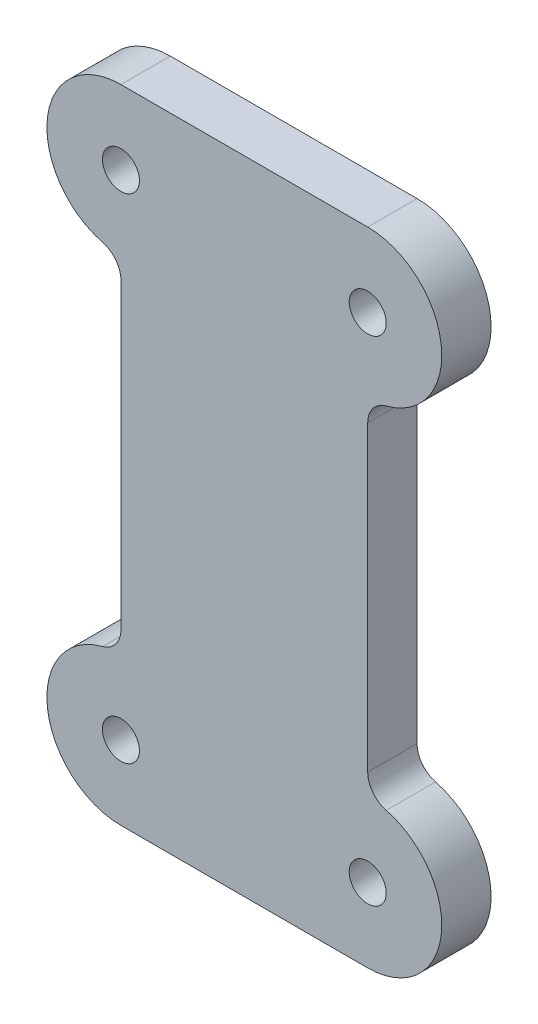
ISO-10303-21;
HEADER;
FILE_DESCRIPTION(('STEP AP214'),'2;1');
FILE_NAME('part.step','',(''),(''),'','','');
FILE_SCHEMA(('AUTOMOTIVE_DESIGN { 1 0 10303 214 1 1 1 1 }'));
ENDSEC;
DATA;
#1=APPLICATION_CONTEXT('core data for automotive mechanical design processes');
#2=APPLICATION_PROTOCOL_DEFINITION('international standard','automotive_design',2000,#1);
#3=PRODUCT_CONTEXT('',#1,'mechanical');
#4=PRODUCT('Part','Part','',(#3));
#5=PRODUCT_RELATED_PRODUCT_CATEGORY('part','',(#4));
#6=PRODUCT_DEFINITION_FORMATION('','',#4);
#7=PRODUCT_DEFINITION_CONTEXT('part definition',#1,'design');
#8=PRODUCT_DEFINITION('design','',#6,#7);
#9=PRODUCT_DEFINITION_SHAPE('','',#8);
#10=(LENGTH_UNIT() NAMED_UNIT(*) SI_UNIT(.MILLI.,.METRE.));
#11=(NAMED_UNIT(*) PLANE_ANGLE_UNIT() SI_UNIT($,.RADIAN.));
#12=(NAMED_UNIT(*) SI_UNIT($,.STERADIAN.) SOLID_ANGLE_UNIT());
#13=UNCERTAINTY_MEASURE_WITH_UNIT(LENGTH_MEASURE(1.E-05),#10,'distance_accuracy_value','');
#14=(GEOMETRIC_REPRESENTATION_CONTEXT(3) GLOBAL_UNCERTAINTY_ASSIGNED_CONTEXT((#13)) GLOBAL_UNIT_ASSIGNED_CONTEXT((#10,
#11,#12)) REPRESENTATION_CONTEXT('',''));
#15=CARTESIAN_POINT('',(0.,0.,0.));
#16=DIRECTION('',(0.,0.,1.));
#17=DIRECTION('',(1.,0.,0.));
#18=AXIS2_PLACEMENT_3D('',#15,#16,#17);
#19=CARTESIAN_POINT('',(0.,-41.275,-3.175));
#20=DIRECTION('',(0.,-1.,0.));
#21=DIRECTION('',(0.,0.,1.));
#22=AXIS2_PLACEMENT_3D('',#19,#20,#21);
#23=PLANE('',#22);
#24=DIRECTION('',(-1.,0.,0.));
#25=VECTOR('',#24,1.);
#26=CARTESIAN_POINT('',(0.,-41.275,0.));
#27=LINE('',#26,#25);
#28=CARTESIAN_POINT('',(15.875,-41.275,0.));
#29=VERTEX_POINT('',#28);
#30=CARTESIAN_POINT('',(-15.875,-41.275,0.));
#31=VERTEX_POINT('',#30);
#32=EDGE_CURVE('E314',#29,#31,#27,.T.);
#33=ORIENTED_EDGE('',*,*,#32,.T.);
#34=DIRECTION('',(0.,0.,1.));
#35=VECTOR('',#34,1.);
#36=CARTESIAN_POINT('',(-15.875,-41.275,-3.175));
#37=LINE('',#36,#35);
#38=CARTESIAN_POINT('',(-15.875,-41.275,-6.35));
#39=VERTEX_POINT('',#38);
#40=EDGE_CURVE('E223',#39,#31,#37,.T.);
#41=ORIENTED_EDGE('',*,*,#40,.F.);
#42=DIRECTION('',(1.,0.,0.));
#43=VECTOR('',#42,1.);
#44=CARTESIAN_POINT('',(0.,-41.275,-6.35));
#45=LINE('',#44,#43);
#46=CARTESIAN_POINT('',(15.875,-41.275,-6.35));
#47=VERTEX_POINT('',#46);
#48=EDGE_CURVE('E203',#39,#47,#45,.T.);
#49=ORIENTED_EDGE('',*,*,#48,.T.);
#50=DIRECTION('',(0.,0.,1.));
#51=VECTOR('',#50,1.);
#52=CARTESIAN_POINT('',(15.875,-41.275,-3.175));
#53=LINE('',#52,#51);
#54=EDGE_CURVE('E212',#47,#29,#53,.T.);
#55=ORIENTED_EDGE('',*,*,#54,.T.);
#56=EDGE_LOOP('',(#33,#41,#49,#55));
#57=FACE_BOUND('',#56,.T.);
#58=ADVANCED_FACE('F35',(#57),#23,.T.);
#59=CARTESIAN_POINT('',(15.875,-31.75,-3.175));
#60=DIRECTION('',(0.,0.,1.));
#61=DIRECTION('',(-1.,0.,0.));
#62=AXIS2_PLACEMENT_3D('',#59,#60,#61);
#63=CYLINDRICAL_SURFACE('',#62,9.525);
#64=CARTESIAN_POINT('',(15.875,-31.75,0.));
#65=DIRECTION('',(0.,0.,1.));
#66=DIRECTION('',(1.,0.,0.));
#67=AXIS2_PLACEMENT_3D('',#64,#65,#66);
#68=CIRCLE('',#67,9.525);
#69=CARTESIAN_POINT('',(18.25625,-22.5274584068436,0.));
#70=VERTEX_POINT('',#69);
#71=EDGE_CURVE('E215',#29,#70,#68,.T.);
#72=ORIENTED_EDGE('',*,*,#71,.F.);
#73=ORIENTED_EDGE('',*,*,#54,.F.);
#74=CARTESIAN_POINT('',(15.875,-31.75,-6.35));
#75=DIRECTION('',(0.,0.,1.));
#76=DIRECTION('',(1.,0.,0.));
#77=AXIS2_PLACEMENT_3D('',#74,#75,#76);
#78=CIRCLE('',#77,9.525);
#79=CARTESIAN_POINT('',(18.25625,-22.5274584068436,-6.35));
#80=VERTEX_POINT('',#79);
#81=EDGE_CURVE('E198',#47,#80,#78,.T.);
#82=ORIENTED_EDGE('',*,*,#81,.T.);
#83=DIRECTION('',(0.,0.,1.));
#84=VECTOR('',#83,1.);
#85=CARTESIAN_POINT('',(18.25625,-22.5274584068436,-3.175));
#86=LINE('',#85,#84);
#87=EDGE_CURVE('E220',#80,#70,#86,.T.);
#88=ORIENTED_EDGE('',*,*,#87,.T.);
#89=EDGE_LOOP('',(#72,#73,#82,#88));
#90=FACE_BOUND('',#89,.T.);
#91=ADVANCED_FACE('F213',(#90),#63,.T.);
#92=CARTESIAN_POINT('',(19.05,-19.4532778757914,-3.175));
#93=DIRECTION('',(0.,0.,1.));
#94=DIRECTION('',(-1.,0.,0.));
#95=AXIS2_PLACEMENT_3D('',#92,#93,#94);
#96=CYLINDRICAL_SURFACE('',#95,3.175);
#97=CARTESIAN_POINT('',(19.05,-19.4532778757914,0.));
#98=DIRECTION('',(0.,0.,1.));
#99=DIRECTION('',(1.,0.,0.));
#100=AXIS2_PLACEMENT_3D('',#97,#98,#99);
#101=CIRCLE('',#100,3.175);
#102=CARTESIAN_POINT('',(15.875,-19.4532778757914,0.));
#103=VERTEX_POINT('',#102);
#104=EDGE_CURVE('E317',#70,#103,#101,.F.);
#105=ORIENTED_EDGE('',*,*,#104,.F.);
#106=ORIENTED_EDGE('',*,*,#87,.F.);
#107=CARTESIAN_POINT('',(19.05,-19.4532778757914,-6.35));
#108=DIRECTION('',(0.,0.,1.));
#109=DIRECTION('',(1.,0.,0.));
#110=AXIS2_PLACEMENT_3D('',#107,#108,#109);
#111=CIRCLE('',#110,3.175);
#112=CARTESIAN_POINT('',(15.875,-19.4532778757914,-6.35));
#113=VERTEX_POINT('',#112);
#114=EDGE_CURVE('E206',#80,#113,#111,.F.);
#115=ORIENTED_EDGE('',*,*,#114,.T.);
#116=DIRECTION('',(0.,0.,1.));
#117=VECTOR('',#116,1.);
#118=CARTESIAN_POINT('',(15.875,-19.4532778757914,-3.175));
#119=LINE('',#118,#117);
#120=EDGE_CURVE('E377',#113,#103,#119,.T.);
#121=ORIENTED_EDGE('',*,*,#120,.T.);
#122=EDGE_LOOP('',(#105,#106,#115,#121));
#123=FACE_BOUND('',#122,.T.);
#124=ADVANCED_FACE('F500',(#123),#96,.F.);
#125=CARTESIAN_POINT('',(15.875,0.,-3.175));
#126=DIRECTION('',(-1.,0.,0.));
#127=DIRECTION('',(0.,0.,-1.));
#128=AXIS2_PLACEMENT_3D('',#125,#126,#127);
#129=PLANE('',#128);
#130=DIRECTION('',(0.,1.,0.));
#131=VECTOR('',#130,1.);
#132=CARTESIAN_POINT('',(15.875,0.,0.));
#133=LINE('',#132,#131);
#134=CARTESIAN_POINT('',(15.875,19.4532778757914,0.));
#135=VERTEX_POINT('',#134);
#136=EDGE_CURVE('E320',#103,#135,#133,.T.);
#137=ORIENTED_EDGE('',*,*,#136,.F.);
#138=ORIENTED_EDGE('',*,*,#120,.F.);
#139=DIRECTION('',(0.,1.,0.));
#140=VECTOR('',#139,1.);
#141=CARTESIAN_POINT('',(15.875,0.,-6.35));
#142=LINE('',#141,#140);
#143=CARTESIAN_POINT('',(15.875,19.4532778757914,-6.35));
#144=VERTEX_POINT('',#143);
#145=EDGE_CURVE('E228',#113,#144,#142,.T.);
#146=ORIENTED_EDGE('',*,*,#145,.T.);
#147=DIRECTION('',(0.,0.,1.));
#148=VECTOR('',#147,1.);
#149=CARTESIAN_POINT('',(15.875,19.4532778757914,-3.175));
#150=LINE('',#149,#148);
#151=EDGE_CURVE('E374',#144,#135,#150,.T.);
#152=ORIENTED_EDGE('',*,*,#151,.T.);
#153=EDGE_LOOP('',(#137,#138,#146,#152));
#154=FACE_BOUND('',#153,.T.);
#155=ADVANCED_FACE('F582',(#154),#129,.F.);
#156=CARTESIAN_POINT('',(19.05,19.4532778757914,-3.175));
#157=DIRECTION('',(0.,0.,1.));
#158=DIRECTION('',(-1.,0.,0.));
#159=AXIS2_PLACEMENT_3D('',#156,#157,#158);
#160=CYLINDRICAL_SURFACE('',#159,3.175);
#161=CARTESIAN_POINT('',(19.05,19.4532778757914,0.));
#162=DIRECTION('',(0.,0.,1.));
#163=DIRECTION('',(1.,0.,0.));
#164=AXIS2_PLACEMENT_3D('',#161,#162,#163);
#165=CIRCLE('',#164,3.175);
#166=CARTESIAN_POINT('',(18.25625,22.5274584068436,0.));
#167=VERTEX_POINT('',#166);
#168=EDGE_CURVE('E323',#167,#135,#165,.T.);
#169=ORIENTED_EDGE('',*,*,#168,.T.);
#170=ORIENTED_EDGE('',*,*,#151,.F.);
#171=CARTESIAN_POINT('',(19.05,19.4532778757914,-6.35));
#172=DIRECTION('',(0.,0.,1.));
#173=DIRECTION('',(1.,0.,0.));
#174=AXIS2_PLACEMENT_3D('',#171,#172,#173);
#175=CIRCLE('',#174,3.175);
#176=CARTESIAN_POINT('',(18.25625,22.5274584068436,-6.35));
#177=VERTEX_POINT('',#176);
#178=EDGE_CURVE('E231',#144,#177,#175,.F.);
#179=ORIENTED_EDGE('',*,*,#178,.T.);
#180=DIRECTION('',(0.,0.,1.));
#181=VECTOR('',#180,1.);
#182=CARTESIAN_POINT('',(18.25625,22.5274584068436,-3.175));
#183=LINE('',#182,#181);
#184=EDGE_CURVE('E371',#177,#167,#183,.T.);
#185=ORIENTED_EDGE('',*,*,#184,.T.);
#186=EDGE_LOOP('',(#169,#170,#179,#185));
#187=FACE_BOUND('',#186,.T.);
#188=ADVANCED_FACE('F578',(#187),#160,.F.);
#189=CARTESIAN_POINT('',(15.875,31.75,-3.175));
#190=DIRECTION('',(0.,0.,1.));
#191=DIRECTION('',(-1.,0.,0.));
#192=AXIS2_PLACEMENT_3D('',#189,#190,#191);
#193=CYLINDRICAL_SURFACE('',#192,9.52500000000001);
#194=CARTESIAN_POINT('',(15.875,31.75,0.));
#195=DIRECTION('',(0.,0.,1.));
#196=DIRECTION('',(1.,0.,0.));
#197=AXIS2_PLACEMENT_3D('',#194,#195,#196);
#198=CIRCLE('',#197,9.52500000000001);
#199=CARTESIAN_POINT('',(15.875,41.275,0.));
#200=VERTEX_POINT('',#199);
#201=EDGE_CURVE('E325',#167,#200,#198,.T.);
#202=ORIENTED_EDGE('',*,*,#201,.F.);
#203=ORIENTED_EDGE('',*,*,#184,.F.);
#204=CARTESIAN_POINT('',(15.875,31.75,-6.35));
#205=DIRECTION('',(0.,0.,1.));
#206=DIRECTION('',(1.,0.,0.));
#207=AXIS2_PLACEMENT_3D('',#204,#205,#206);
#208=CIRCLE('',#207,9.52500000000001);
#209=CARTESIAN_POINT('',(15.875,41.275,-6.35));
#210=VERTEX_POINT('',#209);
#211=EDGE_CURVE('E234',#177,#210,#208,.T.);
#212=ORIENTED_EDGE('',*,*,#211,.T.);
#213=DIRECTION('',(0.,0.,1.));
#214=VECTOR('',#213,1.);
#215=CARTESIAN_POINT('',(15.875,41.275,-3.175));
#216=LINE('',#215,#214);
#217=EDGE_CURVE('E368',#210,#200,#216,.T.);
#218=ORIENTED_EDGE('',*,*,#217,.T.);
#219=EDGE_LOOP('',(#202,#203,#212,#218));
#220=FACE_BOUND('',#219,.T.);
#221=ADVANCED_FACE('F574',(#220),#193,.T.);
#222=CARTESIAN_POINT('',(0.,41.275,-3.175));
#223=DIRECTION('',(0.,-1.,0.));
#224=DIRECTION('',(0.,0.,1.));
#225=AXIS2_PLACEMENT_3D('',#222,#223,#224);
#226=PLANE('',#225);
#227=DIRECTION('',(-1.,0.,0.));
#228=VECTOR('',#227,1.);
#229=CARTESIAN_POINT('',(0.,41.275,0.));
#230=LINE('',#229,#228);
#231=CARTESIAN_POINT('',(-15.875,41.275,0.));
#232=VERTEX_POINT('',#231);
#233=EDGE_CURVE('E328',#200,#232,#230,.T.);
#234=ORIENTED_EDGE('',*,*,#233,.F.);
#235=ORIENTED_EDGE('',*,*,#217,.F.);
#236=DIRECTION('',(-1.,0.,0.));
#237=VECTOR('',#236,1.);
#238=CARTESIAN_POINT('',(0.,41.275,-6.35));
#239=LINE('',#238,#237);
#240=CARTESIAN_POINT('',(-15.875,41.275,-6.35));
#241=VERTEX_POINT('',#240);
#242=EDGE_CURVE('E237',#210,#241,#239,.T.);
#243=ORIENTED_EDGE('',*,*,#242,.T.);
#244=DIRECTION('',(0.,0.,1.));
#245=VECTOR('',#244,1.);
#246=CARTESIAN_POINT('',(-15.875,41.275,-3.175));
#247=LINE('',#246,#245);
#248=EDGE_CURVE('E365',#241,#232,#247,.T.);
#249=ORIENTED_EDGE('',*,*,#248,.T.);
#250=EDGE_LOOP('',(#234,#235,#243,#249));
#251=FACE_BOUND('',#250,.T.);
#252=ADVANCED_FACE('F570',(#251),#226,.F.);
#253=CARTESIAN_POINT('',(-15.875,31.75,-3.175));
#254=DIRECTION('',(0.,0.,1.));
#255=DIRECTION('',(-1.,0.,0.));
#256=AXIS2_PLACEMENT_3D('',#253,#254,#255);
#257=CYLINDRICAL_SURFACE('',#256,9.52500000000001);
#258=CARTESIAN_POINT('',(-15.875,31.75,0.));
#259=DIRECTION('',(0.,0.,1.));
#260=DIRECTION('',(1.,0.,0.));
#261=AXIS2_PLACEMENT_3D('',#258,#259,#260);
#262=CIRCLE('',#261,9.52500000000001);
#263=CARTESIAN_POINT('',(-18.25625,22.5274584068436,0.));
#264=VERTEX_POINT('',#263);
#265=EDGE_CURVE('E331',#232,#264,#262,.T.);
#266=ORIENTED_EDGE('',*,*,#265,.F.);
#267=ORIENTED_EDGE('',*,*,#248,.F.);
#268=CARTESIAN_POINT('',(-15.875,31.75,-6.35));
#269=DIRECTION('',(0.,0.,1.));
#270=DIRECTION('',(1.,0.,0.));
#271=AXIS2_PLACEMENT_3D('',#268,#269,#270);
#272=CIRCLE('',#271,9.52500000000001);
#273=CARTESIAN_POINT('',(-18.25625,22.5274584068436,-6.35));
#274=VERTEX_POINT('',#273);
#275=EDGE_CURVE('E240',#241,#274,#272,.T.);
#276=ORIENTED_EDGE('',*,*,#275,.T.);
#277=DIRECTION('',(0.,0.,1.));
#278=VECTOR('',#277,1.);
#279=CARTESIAN_POINT('',(-18.25625,22.5274584068436,-3.175));
#280=LINE('',#279,#278);
#281=EDGE_CURVE('E362',#274,#264,#280,.T.);
#282=ORIENTED_EDGE('',*,*,#281,.T.);
#283=EDGE_LOOP('',(#266,#267,#276,#282));
#284=FACE_BOUND('',#283,.T.);
#285=ADVANCED_FACE('F566',(#284),#257,.T.);
#286=CARTESIAN_POINT('',(-19.05,19.4532778757914,-3.175));
#287=DIRECTION('',(0.,0.,1.));
#288=DIRECTION('',(-1.,0.,0.));
#289=AXIS2_PLACEMENT_3D('',#286,#287,#288);
#290=CYLINDRICAL_SURFACE('',#289,3.175);
#291=CARTESIAN_POINT('',(-19.05,19.4532778757914,0.));
#292=DIRECTION('',(0.,0.,1.));
#293=DIRECTION('',(1.,0.,0.));
#294=AXIS2_PLACEMENT_3D('',#291,#292,#293);
#295=CIRCLE('',#294,3.175);
#296=CARTESIAN_POINT('',(-15.875,19.4532778757914,0.));
#297=VERTEX_POINT('',#296);
#298=EDGE_CURVE('E334',#264,#297,#295,.F.);
#299=ORIENTED_EDGE('',*,*,#298,.F.);
#300=ORIENTED_EDGE('',*,*,#281,.F.);
#301=CARTESIAN_POINT('',(-19.05,19.4532778757914,-6.35));
#302=DIRECTION('',(0.,0.,1.));
#303=DIRECTION('',(1.,0.,0.));
#304=AXIS2_PLACEMENT_3D('',#301,#302,#303);
#305=CIRCLE('',#304,3.175);
#306=CARTESIAN_POINT('',(-15.875,19.4532778757914,-6.35));
#307=VERTEX_POINT('',#306);
#308=EDGE_CURVE('E243',#274,#307,#305,.F.);
#309=ORIENTED_EDGE('',*,*,#308,.T.);
#310=DIRECTION('',(0.,0.,1.));
#311=VECTOR('',#310,1.);
#312=CARTESIAN_POINT('',(-15.875,19.4532778757914,-3.175));
#313=LINE('',#312,#311);
#314=EDGE_CURVE('E359',#307,#297,#313,.T.);
#315=ORIENTED_EDGE('',*,*,#314,.T.);
#316=EDGE_LOOP('',(#299,#300,#309,#315));
#317=FACE_BOUND('',#316,.T.);
#318=ADVANCED_FACE('F562',(#317),#290,.F.);
#319=CARTESIAN_POINT('',(-15.875,0.,-3.175));
#320=DIRECTION('',(-1.,0.,0.));
#321=DIRECTION('',(0.,0.,-1.));
#322=AXIS2_PLACEMENT_3D('',#319,#320,#321);
#323=PLANE('',#322);
#324=DIRECTION('',(0.,1.,0.));
#325=VECTOR('',#324,1.);
#326=CARTESIAN_POINT('',(-15.875,0.,0.));
#327=LINE('',#326,#325);
#328=CARTESIAN_POINT('',(-15.875,-19.4532778757914,0.));
#329=VERTEX_POINT('',#328);
#330=EDGE_CURVE('E337',#329,#297,#327,.T.);
#331=ORIENTED_EDGE('',*,*,#330,.T.);
#332=ORIENTED_EDGE('',*,*,#314,.F.);
#333=DIRECTION('',(0.,-1.,0.));
#334=VECTOR('',#333,1.);
#335=CARTESIAN_POINT('',(-15.875,0.,-6.35));
#336=LINE('',#335,#334);
#337=CARTESIAN_POINT('',(-15.875,-19.4532778757914,-6.35));
#338=VERTEX_POINT('',#337);
#339=EDGE_CURVE('E246',#307,#338,#336,.T.);
#340=ORIENTED_EDGE('',*,*,#339,.T.);
#341=DIRECTION('',(0.,0.,1.));
#342=VECTOR('',#341,1.);
#343=CARTESIAN_POINT('',(-15.875,-19.4532778757914,-3.175));
#344=LINE('',#343,#342);
#345=EDGE_CURVE('E356',#338,#329,#344,.T.);
#346=ORIENTED_EDGE('',*,*,#345,.T.);
#347=EDGE_LOOP('',(#331,#332,#340,#346));
#348=FACE_BOUND('',#347,.T.);
#349=ADVANCED_FACE('F558',(#348),#323,.T.);
#350=CARTESIAN_POINT('',(-19.05,-19.4532778757914,-3.175));
#351=DIRECTION('',(0.,0.,1.));
#352=DIRECTION('',(-1.,0.,0.));
#353=AXIS2_PLACEMENT_3D('',#350,#351,#352);
#354=CYLINDRICAL_SURFACE('',#353,3.175);
#355=CARTESIAN_POINT('',(-19.05,-19.4532778757914,0.));
#356=DIRECTION('',(0.,0.,1.));
#357=DIRECTION('',(1.,0.,0.));
#358=AXIS2_PLACEMENT_3D('',#355,#356,#357);
#359=CIRCLE('',#358,3.175);
#360=CARTESIAN_POINT('',(-18.25625,-22.5274584068436,0.));
#361=VERTEX_POINT('',#360);
#362=EDGE_CURVE('E339',#361,#329,#359,.T.);
#363=ORIENTED_EDGE('',*,*,#362,.T.);
#364=ORIENTED_EDGE('',*,*,#345,.F.);
#365=CARTESIAN_POINT('',(-19.05,-19.4532778757914,-6.35));
#366=DIRECTION('',(0.,0.,1.));
#367=DIRECTION('',(1.,0.,0.));
#368=AXIS2_PLACEMENT_3D('',#365,#366,#367);
#369=CIRCLE('',#368,3.175);
#370=CARTESIAN_POINT('',(-18.25625,-22.5274584068436,-6.35));
#371=VERTEX_POINT('',#370);
#372=EDGE_CURVE('E249',#338,#371,#369,.F.);
#373=ORIENTED_EDGE('',*,*,#372,.T.);
#374=DIRECTION('',(0.,0.,1.));
#375=VECTOR('',#374,1.);
#376=CARTESIAN_POINT('',(-18.25625,-22.5274584068436,-3.175));
#377=LINE('',#376,#375);
#378=EDGE_CURVE('E353',#371,#361,#377,.T.);
#379=ORIENTED_EDGE('',*,*,#378,.T.);
#380=EDGE_LOOP('',(#363,#364,#373,#379));
#381=FACE_BOUND('',#380,.T.);
#382=ADVANCED_FACE('F551',(#381),#354,.F.);
#383=CARTESIAN_POINT('',(15.875,31.75,-3.175));
#384=DIRECTION('',(0.,0.,1.));
#385=DIRECTION('',(-1.,0.,0.));
#386=AXIS2_PLACEMENT_3D('',#383,#384,#385);
#387=CYLINDRICAL_SURFACE('',#386,2.38125);
#388=CARTESIAN_POINT('',(15.875,31.75,0.));
#389=DIRECTION('',(0.,0.,1.));
#390=DIRECTION('',(1.,0.,0.));
#391=AXIS2_PLACEMENT_3D('',#388,#389,#390);
#392=CIRCLE('',#391,2.38125);
#393=CARTESIAN_POINT('',(18.25625,31.75,0.));
#394=VERTEX_POINT('',#393);
#395=EDGE_CURVE('E346',#394,#394,#392,.T.);
#396=ORIENTED_EDGE('',*,*,#395,.T.);
#397=EDGE_LOOP('',(#396));
#398=FACE_BOUND('',#397,.T.);
#399=CARTESIAN_POINT('',(15.875,31.75,-6.35));
#400=DIRECTION('',(0.,0.,1.));
#401=DIRECTION('',(1.,0.,0.));
#402=AXIS2_PLACEMENT_3D('',#399,#400,#401);
#403=CIRCLE('',#402,2.38125);
#404=CARTESIAN_POINT('',(18.25625,31.75,-6.35));
#405=VERTEX_POINT('',#404);
#406=EDGE_CURVE('E254',#405,#405,#403,.F.);
#407=ORIENTED_EDGE('',*,*,#406,.T.);
#408=EDGE_LOOP('',(#407));
#409=FACE_BOUND('',#408,.T.);
#410=ADVANCED_FACE('F548',(#398,#409),#387,.F.);
#411=CARTESIAN_POINT('',(15.875,-31.75,-3.175));
#412=DIRECTION('',(0.,0.,1.));
#413=DIRECTION('',(-1.,0.,0.));
#414=AXIS2_PLACEMENT_3D('',#411,#412,#413);
#415=CYLINDRICAL_SURFACE('',#414,2.38125);
#416=CARTESIAN_POINT('',(15.875,-31.75,0.));
#417=DIRECTION('',(0.,0.,1.));
#418=DIRECTION('',(1.,0.,0.));
#419=AXIS2_PLACEMENT_3D('',#416,#417,#418);
#420=CIRCLE('',#419,2.38125);
#421=CARTESIAN_POINT('',(18.25625,-31.75,0.));
#422=VERTEX_POINT('',#421);
#423=EDGE_CURVE('E343',#422,#422,#420,.T.);
#424=ORIENTED_EDGE('',*,*,#423,.T.);
#425=EDGE_LOOP('',(#424));
#426=FACE_BOUND('',#425,.T.);
#427=CARTESIAN_POINT('',(15.875,-31.75,-6.35));
#428=DIRECTION('',(0.,0.,1.));
#429=DIRECTION('',(1.,0.,0.));
#430=AXIS2_PLACEMENT_3D('',#427,#428,#429);
#431=CIRCLE('',#430,2.38125);
#432=CARTESIAN_POINT('',(18.25625,-31.75,-6.35));
#433=VERTEX_POINT('',#432);
#434=EDGE_CURVE('E257',#433,#433,#431,.F.);
#435=ORIENTED_EDGE('',*,*,#434,.T.);
#436=EDGE_LOOP('',(#435));
#437=FACE_BOUND('',#436,.T.);
#438=ADVANCED_FACE('F515',(#426,#437),#415,.F.);
#439=CARTESIAN_POINT('',(-15.875,-31.75,-3.175));
#440=DIRECTION('',(0.,0.,1.));
#441=DIRECTION('',(-1.,0.,0.));
#442=AXIS2_PLACEMENT_3D('',#439,#440,#441);
#443=CYLINDRICAL_SURFACE('',#442,9.525);
#444=CARTESIAN_POINT('',(-15.875,-31.75,0.));
#445=DIRECTION('',(0.,0.,1.));
#446=DIRECTION('',(1.,0.,0.));
#447=AXIS2_PLACEMENT_3D('',#444,#445,#446);
#448=CIRCLE('',#447,9.525);
#449=EDGE_CURVE('E341',#361,#31,#448,.T.);
#450=ORIENTED_EDGE('',*,*,#449,.F.);
#451=ORIENTED_EDGE('',*,*,#378,.F.);
#452=CARTESIAN_POINT('',(-15.875,-31.75,-6.35));
#453=DIRECTION('',(0.,0.,1.));
#454=DIRECTION('',(1.,0.,0.));
#455=AXIS2_PLACEMENT_3D('',#452,#453,#454);
#456=CIRCLE('',#455,9.525);
#457=EDGE_CURVE('E252',#371,#39,#456,.T.);
#458=ORIENTED_EDGE('',*,*,#457,.T.);
#459=ORIENTED_EDGE('',*,*,#40,.T.);
#460=EDGE_LOOP('',(#450,#451,#458,#459));
#461=FACE_BOUND('',#460,.T.);
#462=ADVANCED_FACE('F506',(#461),#443,.T.);
#463=CARTESIAN_POINT('',(-15.875,-31.75,-3.175));
#464=DIRECTION('',(0.,0.,1.));
#465=DIRECTION('',(-1.,0.,0.));
#466=AXIS2_PLACEMENT_3D('',#463,#464,#465);
#467=CYLINDRICAL_SURFACE('',#466,2.38125);
#468=CARTESIAN_POINT('',(-15.875,-31.75,0.));
#469=DIRECTION('',(0.,0.,1.));
#470=DIRECTION('',(1.,0.,0.));
#471=AXIS2_PLACEMENT_3D('',#468,#469,#470);
#472=CIRCLE('',#471,2.38125);
#473=CARTESIAN_POINT('',(-13.49375,-31.75,0.));
#474=VERTEX_POINT('',#473);
#475=EDGE_CURVE('E311',#474,#474,#472,.T.);
#476=ORIENTED_EDGE('',*,*,#475,.T.);
#477=EDGE_LOOP('',(#476));
#478=FACE_BOUND('',#477,.T.);
#479=CARTESIAN_POINT('',(-15.875,-31.75,-6.35));
#480=DIRECTION('',(0.,0.,1.));
#481=DIRECTION('',(1.,0.,0.));
#482=AXIS2_PLACEMENT_3D('',#479,#480,#481);
#483=CIRCLE('',#482,2.38125);
#484=CARTESIAN_POINT('',(-13.49375,-31.75,-6.35));
#485=VERTEX_POINT('',#484);
#486=EDGE_CURVE('E263',#485,#485,#483,.F.);
#487=ORIENTED_EDGE('',*,*,#486,.T.);
#488=EDGE_LOOP('',(#487));
#489=FACE_BOUND('',#488,.T.);
#490=ADVANCED_FACE('F503',(#478,#489),#467,.F.);
#491=CARTESIAN_POINT('',(-15.875,31.75,-3.175));
#492=DIRECTION('',(0.,0.,1.));
#493=DIRECTION('',(-1.,0.,0.));
#494=AXIS2_PLACEMENT_3D('',#491,#492,#493);
#495=CYLINDRICAL_SURFACE('',#494,2.38125);
#496=CARTESIAN_POINT('',(-15.875,31.75,0.));
#497=DIRECTION('',(0.,0.,1.));
#498=DIRECTION('',(1.,0.,0.));
#499=AXIS2_PLACEMENT_3D('',#496,#497,#498);
#500=CIRCLE('',#499,2.38125);
#501=CARTESIAN_POINT('',(-13.49375,31.75,0.));
#502=VERTEX_POINT('',#501);
#503=EDGE_CURVE('E349',#502,#502,#500,.T.);
#504=ORIENTED_EDGE('',*,*,#503,.T.);
#505=EDGE_LOOP('',(#504));
#506=FACE_BOUND('',#505,.T.);
#507=CARTESIAN_POINT('',(-15.875,31.75,-6.35));
#508=DIRECTION('',(0.,0.,1.));
#509=DIRECTION('',(1.,0.,0.));
#510=AXIS2_PLACEMENT_3D('',#507,#508,#509);
#511=CIRCLE('',#510,2.38125);
#512=CARTESIAN_POINT('',(-13.49375,31.75,-6.35));
#513=VERTEX_POINT('',#512);
#514=EDGE_CURVE('E260',#513,#513,#511,.F.);
#515=ORIENTED_EDGE('',*,*,#514,.T.);
#516=EDGE_LOOP('',(#515));
#517=FACE_BOUND('',#516,.T.);
#518=ADVANCED_FACE('F505',(#506,#517),#495,.F.);
#519=CARTESIAN_POINT('',(0.,0.,0.));
#520=DIRECTION('',(0.,0.,-1.));
#521=DIRECTION('',(1.,0.,0.));
#522=AXIS2_PLACEMENT_3D('',#519,#520,#521);
#523=PLANE('',#522);
#524=ORIENTED_EDGE('',*,*,#475,.F.);
#525=EDGE_LOOP('',(#524));
#526=FACE_BOUND('',#525,.T.);
#527=ORIENTED_EDGE('',*,*,#32,.F.);
#528=ORIENTED_EDGE('',*,*,#71,.T.);
#529=ORIENTED_EDGE('',*,*,#104,.T.);
#530=ORIENTED_EDGE('',*,*,#136,.T.);
#531=ORIENTED_EDGE('',*,*,#168,.F.);
#532=ORIENTED_EDGE('',*,*,#201,.T.);
#533=ORIENTED_EDGE('',*,*,#233,.T.);
#534=ORIENTED_EDGE('',*,*,#265,.T.);
#535=ORIENTED_EDGE('',*,*,#298,.T.);
#536=ORIENTED_EDGE('',*,*,#330,.F.);
#537=ORIENTED_EDGE('',*,*,#362,.F.);
#538=ORIENTED_EDGE('',*,*,#449,.T.);
#539=EDGE_LOOP('',(#527,#528,#529,#530,#531,#532,#533,#534,#535,#536,#537,#538));
#540=FACE_BOUND('',#539,.T.);
#541=ORIENTED_EDGE('',*,*,#423,.F.);
#542=EDGE_LOOP('',(#541));
#543=FACE_BOUND('',#542,.T.);
#544=ORIENTED_EDGE('',*,*,#395,.F.);
#545=EDGE_LOOP('',(#544));
#546=FACE_BOUND('',#545,.T.);
#547=ORIENTED_EDGE('',*,*,#503,.F.);
#548=EDGE_LOOP('',(#547));
#549=FACE_BOUND('',#548,.T.);
#550=ADVANCED_FACE('F512',(#526,#540,#543,#546,#549),#523,.F.);
#551=CARTESIAN_POINT('',(-6.35,31.75,-6.35));
#552=DIRECTION('',(0.,0.,1.));
#553=DIRECTION('',(-1.,0.,0.));
#554=AXIS2_PLACEMENT_3D('',#551,#552,#553);
#555=CYLINDRICAL_SURFACE('',#554,3.175);
#556=DIRECTION('',(0.,0.,1.));
#557=VECTOR('',#556,1.);
#558=CARTESIAN_POINT('',(-9.525,31.75,-6.35));
#559=LINE('',#558,#557);
#560=CARTESIAN_POINT('',(-9.525,31.75,-6.35));
#561=VERTEX_POINT('',#560);
#562=CARTESIAN_POINT('',(-9.525,31.75,-4.1275));
#563=VERTEX_POINT('',#562);
#564=EDGE_CURVE('E287',#561,#563,#559,.T.);
#565=ORIENTED_EDGE('',*,*,#564,.F.);
#566=CARTESIAN_POINT('',(-6.35,31.75,-6.35));
#567=DIRECTION('',(0.,0.,1.));
#568=DIRECTION('',(1.,0.,0.));
#569=AXIS2_PLACEMENT_3D('',#566,#567,#568);
#570=CIRCLE('',#569,3.175);
#571=CARTESIAN_POINT('',(-6.34999999999998,34.925,-6.35));
#572=VERTEX_POINT('',#571);
#573=EDGE_CURVE('E266',#572,#561,#570,.T.);
#574=ORIENTED_EDGE('',*,*,#573,.F.);
#575=DIRECTION('',(0.,0.,1.));
#576=VECTOR('',#575,1.);
#577=CARTESIAN_POINT('',(-6.34999999999998,34.925,-6.35));
#578=LINE('',#577,#576);
#579=CARTESIAN_POINT('',(-6.34999999999998,34.925,-4.1275));
#580=VERTEX_POINT('',#579);
#581=EDGE_CURVE('E308',#572,#580,#578,.T.);
#582=ORIENTED_EDGE('',*,*,#581,.T.);
#583=CARTESIAN_POINT('',(-6.35,31.75,-4.1275));
#584=DIRECTION('',(0.,0.,1.));
#585=DIRECTION('',(1.,0.,0.));
#586=AXIS2_PLACEMENT_3D('',#583,#584,#585);
#587=CIRCLE('',#586,3.175);
#588=EDGE_CURVE('E11',#563,#580,#587,.F.);
#589=ORIENTED_EDGE('',*,*,#588,.F.);
#590=EDGE_LOOP('',(#565,#574,#582,#589));
#591=FACE_BOUND('',#590,.T.);
#592=ADVANCED_FACE('F478',(#591),#555,.F.);
#593=CARTESIAN_POINT('',(0.,34.925,-6.35));
#594=DIRECTION('',(0.,1.,0.));
#595=DIRECTION('',(0.,0.,-1.));
#596=AXIS2_PLACEMENT_3D('',#593,#594,#595);
#597=PLANE('',#596);
#598=ORIENTED_EDGE('',*,*,#581,.F.);
#599=DIRECTION('',(1.,0.,0.));
#600=VECTOR('',#599,1.);
#601=CARTESIAN_POINT('',(0.,34.925,-6.35));
#602=LINE('',#601,#600);
#603=CARTESIAN_POINT('',(6.34999999999997,34.925,-6.35));
#604=VERTEX_POINT('',#603);
#605=EDGE_CURVE('E269',#572,#604,#602,.T.);
#606=ORIENTED_EDGE('',*,*,#605,.T.);
#607=DIRECTION('',(0.,0.,1.));
#608=VECTOR('',#607,1.);
#609=CARTESIAN_POINT('',(6.34999999999997,34.925,-6.35));
#610=LINE('',#609,#608);
#611=CARTESIAN_POINT('',(6.34999999999997,34.925,-4.1275));
#612=VERTEX_POINT('',#611);
#613=EDGE_CURVE('E305',#604,#612,#610,.T.);
#614=ORIENTED_EDGE('',*,*,#613,.T.);
#615=DIRECTION('',(1.,0.,0.));
#616=VECTOR('',#615,1.);
#617=CARTESIAN_POINT('',(0.,34.925,-4.1275));
#618=LINE('',#617,#616);
#619=EDGE_CURVE('E219',#580,#612,#618,.T.);
#620=ORIENTED_EDGE('',*,*,#619,.F.);
#621=EDGE_LOOP('',(#598,#606,#614,#620));
#622=FACE_BOUND('',#621,.T.);
#623=ADVANCED_FACE('F475',(#622),#597,.F.);
#624=CARTESIAN_POINT('',(6.35,31.75,-6.35));
#625=DIRECTION('',(0.,0.,1.));
#626=DIRECTION('',(-1.,0.,0.));
#627=AXIS2_PLACEMENT_3D('',#624,#625,#626);
#628=CYLINDRICAL_SURFACE('',#627,3.175);
#629=ORIENTED_EDGE('',*,*,#613,.F.);
#630=CARTESIAN_POINT('',(6.35,31.75,-6.35));
#631=DIRECTION('',(0.,0.,1.));
#632=DIRECTION('',(1.,0.,0.));
#633=AXIS2_PLACEMENT_3D('',#630,#631,#632);
#634=CIRCLE('',#633,3.175);
#635=CARTESIAN_POINT('',(9.525,31.75,-6.35));
#636=VERTEX_POINT('',#635);
#637=EDGE_CURVE('E272',#604,#636,#634,.F.);
#638=ORIENTED_EDGE('',*,*,#637,.T.);
#639=DIRECTION('',(0.,0.,1.));
#640=VECTOR('',#639,1.);
#641=CARTESIAN_POINT('',(9.525,31.75,-6.35));
#642=LINE('',#641,#640);
#643=CARTESIAN_POINT('',(9.525,31.75,-4.1275));
#644=VERTEX_POINT('',#643);
#645=EDGE_CURVE('E302',#636,#644,#642,.T.);
#646=ORIENTED_EDGE('',*,*,#645,.T.);
#647=CARTESIAN_POINT('',(6.35,31.75,-4.1275));
#648=DIRECTION('',(0.,0.,1.));
#649=DIRECTION('',(1.,0.,0.));
#650=AXIS2_PLACEMENT_3D('',#647,#648,#649);
#651=CIRCLE('',#650,3.175);
#652=EDGE_CURVE('E405',#612,#644,#651,.F.);
#653=ORIENTED_EDGE('',*,*,#652,.F.);
#654=EDGE_LOOP('',(#629,#638,#646,#653));
#655=FACE_BOUND('',#654,.T.);
#656=ADVANCED_FACE('F469',(#655),#628,.F.);
#657=CARTESIAN_POINT('',(9.525,0.,-6.35));
#658=DIRECTION('',(1.,0.,0.));
#659=DIRECTION('',(0.,1.,0.));
#660=AXIS2_PLACEMENT_3D('',#657,#658,#659);
#661=PLANE('',#660);
#662=ORIENTED_EDGE('',*,*,#645,.F.);
#663=DIRECTION('',(0.,-1.,0.));
#664=VECTOR('',#663,1.);
#665=CARTESIAN_POINT('',(9.525,0.,-6.35));
#666=LINE('',#665,#664);
#667=CARTESIAN_POINT('',(9.525,-31.75,-6.35));
#668=VERTEX_POINT('',#667);
#669=EDGE_CURVE('E275',#636,#668,#666,.T.);
#670=ORIENTED_EDGE('',*,*,#669,.T.);
#671=DIRECTION('',(0.,0.,1.));
#672=VECTOR('',#671,1.);
#673=CARTESIAN_POINT('',(9.525,-31.75,-6.35));
#674=LINE('',#673,#672);
#675=CARTESIAN_POINT('',(9.525,-31.75,-4.1275));
#676=VERTEX_POINT('',#675);
#677=EDGE_CURVE('E299',#668,#676,#674,.T.);
#678=ORIENTED_EDGE('',*,*,#677,.T.);
#679=DIRECTION('',(0.,-1.,0.));
#680=VECTOR('',#679,1.);
#681=CARTESIAN_POINT('',(9.525,0.,-4.1275));
#682=LINE('',#681,#680);
#683=EDGE_CURVE('E408',#644,#676,#682,.T.);
#684=ORIENTED_EDGE('',*,*,#683,.F.);
#685=EDGE_LOOP('',(#662,#670,#678,#684));
#686=FACE_BOUND('',#685,.T.);
#687=ADVANCED_FACE('F465',(#686),#661,.F.);
#688=CARTESIAN_POINT('',(6.35,-31.75,-6.35));
#689=DIRECTION('',(0.,0.,1.));
#690=DIRECTION('',(-1.,0.,0.));
#691=AXIS2_PLACEMENT_3D('',#688,#689,#690);
#692=CYLINDRICAL_SURFACE('',#691,3.175);
#693=ORIENTED_EDGE('',*,*,#677,.F.);
#694=CARTESIAN_POINT('',(6.35,-31.75,-6.35));
#695=DIRECTION('',(0.,0.,1.));
#696=DIRECTION('',(1.,0.,0.));
#697=AXIS2_PLACEMENT_3D('',#694,#695,#696);
#698=CIRCLE('',#697,3.175);
#699=CARTESIAN_POINT('',(6.34999999999998,-34.925,-6.35));
#700=VERTEX_POINT('',#699);
#701=EDGE_CURVE('E278',#700,#668,#698,.T.);
#702=ORIENTED_EDGE('',*,*,#701,.F.);
#703=DIRECTION('',(0.,0.,1.));
#704=VECTOR('',#703,1.);
#705=CARTESIAN_POINT('',(6.34999999999998,-34.925,-6.35));
#706=LINE('',#705,#704);
#707=CARTESIAN_POINT('',(6.34999999999998,-34.925,-4.1275));
#708=VERTEX_POINT('',#707);
#709=EDGE_CURVE('E296',#700,#708,#706,.T.);
#710=ORIENTED_EDGE('',*,*,#709,.T.);
#711=CARTESIAN_POINT('',(6.35,-31.75,-4.1275));
#712=DIRECTION('',(0.,0.,1.));
#713=DIRECTION('',(1.,0.,0.));
#714=AXIS2_PLACEMENT_3D('',#711,#712,#713);
#715=CIRCLE('',#714,3.175);
#716=EDGE_CURVE('E411',#676,#708,#715,.F.);
#717=ORIENTED_EDGE('',*,*,#716,.F.);
#718=EDGE_LOOP('',(#693,#702,#710,#717));
#719=FACE_BOUND('',#718,.T.);
#720=ADVANCED_FACE('F445',(#719),#692,.F.);
#721=CARTESIAN_POINT('',(0.,-34.925,-6.35));
#722=DIRECTION('',(0.,1.,0.));
#723=DIRECTION('',(0.,0.,-1.));
#724=AXIS2_PLACEMENT_3D('',#721,#722,#723);
#725=PLANE('',#724);
#726=ORIENTED_EDGE('',*,*,#709,.F.);
#727=DIRECTION('',(1.,0.,0.));
#728=VECTOR('',#727,1.);
#729=CARTESIAN_POINT('',(0.,-34.925,-6.35));
#730=LINE('',#729,#728);
#731=CARTESIAN_POINT('',(-6.34999999999997,-34.925,-6.35));
#732=VERTEX_POINT('',#731);
#733=EDGE_CURVE('E280',#732,#700,#730,.T.);
#734=ORIENTED_EDGE('',*,*,#733,.F.);
#735=DIRECTION('',(0.,0.,1.));
#736=VECTOR('',#735,1.);
#737=CARTESIAN_POINT('',(-6.34999999999997,-34.925,-6.35));
#738=LINE('',#737,#736);
#739=CARTESIAN_POINT('',(-6.34999999999997,-34.925,-4.1275));
#740=VERTEX_POINT('',#739);
#741=EDGE_CURVE('E293',#732,#740,#738,.T.);
#742=ORIENTED_EDGE('',*,*,#741,.T.);
#743=DIRECTION('',(1.,0.,0.));
#744=VECTOR('',#743,1.);
#745=CARTESIAN_POINT('',(-6.34999999999997,-34.925,-4.1275));
#746=LINE('',#745,#744);
#747=EDGE_CURVE('E414',#708,#740,#746,.F.);
#748=ORIENTED_EDGE('',*,*,#747,.F.);
#749=EDGE_LOOP('',(#726,#734,#742,#748));
#750=FACE_BOUND('',#749,.T.);
#751=ADVANCED_FACE('F437',(#750),#725,.T.);
#752=CARTESIAN_POINT('',(-6.34999999999999,-31.75,-6.35));
#753=DIRECTION('',(0.,0.,1.));
#754=DIRECTION('',(-1.,0.,0.));
#755=AXIS2_PLACEMENT_3D('',#752,#753,#754);
#756=CYLINDRICAL_SURFACE('',#755,3.175);
#757=ORIENTED_EDGE('',*,*,#741,.F.);
#758=CARTESIAN_POINT('',(-6.34999999999999,-31.75,-6.35));
#759=DIRECTION('',(0.,0.,1.));
#760=DIRECTION('',(1.,0.,0.));
#761=AXIS2_PLACEMENT_3D('',#758,#759,#760);
#762=CIRCLE('',#761,3.175);
#763=CARTESIAN_POINT('',(-9.52499999999999,-31.75,-6.35));
#764=VERTEX_POINT('',#763);
#765=EDGE_CURVE('E282',#732,#764,#762,.F.);
#766=ORIENTED_EDGE('',*,*,#765,.T.);
#767=DIRECTION('',(0.,0.,1.));
#768=VECTOR('',#767,1.);
#769=CARTESIAN_POINT('',(-9.52499999999999,-31.75,-6.35));
#770=LINE('',#769,#768);
#771=CARTESIAN_POINT('',(-9.52499999999999,-31.75,-4.1275));
#772=VERTEX_POINT('',#771);
#773=EDGE_CURVE('E290',#764,#772,#770,.T.);
#774=ORIENTED_EDGE('',*,*,#773,.T.);
#775=CARTESIAN_POINT('',(-6.34999999999999,-31.75,-4.1275));
#776=DIRECTION('',(0.,0.,1.));
#777=DIRECTION('',(1.,0.,0.));
#778=AXIS2_PLACEMENT_3D('',#775,#776,#777);
#779=CIRCLE('',#778,3.175);
#780=EDGE_CURVE('E417',#740,#772,#779,.F.);
#781=ORIENTED_EDGE('',*,*,#780,.F.);
#782=EDGE_LOOP('',(#757,#766,#774,#781));
#783=FACE_BOUND('',#782,.T.);
#784=ADVANCED_FACE('F451',(#783),#756,.F.);
#785=CARTESIAN_POINT('',(-9.525,0.,-6.35));
#786=DIRECTION('',(1.,0.,0.));
#787=DIRECTION('',(0.,1.,0.));
#788=AXIS2_PLACEMENT_3D('',#785,#786,#787);
#789=PLANE('',#788);
#790=ORIENTED_EDGE('',*,*,#773,.F.);
#791=DIRECTION('',(0.,-1.,0.));
#792=VECTOR('',#791,1.);
#793=CARTESIAN_POINT('',(-9.525,0.,-6.35));
#794=LINE('',#793,#792);
#795=EDGE_CURVE('E285',#561,#764,#794,.T.);
#796=ORIENTED_EDGE('',*,*,#795,.F.);
#797=ORIENTED_EDGE('',*,*,#564,.T.);
#798=DIRECTION('',(0.,-1.,0.));
#799=VECTOR('',#798,1.);
#800=CARTESIAN_POINT('',(-9.525,31.75,-4.1275));
#801=LINE('',#800,#799);
#802=EDGE_CURVE('E44',#772,#563,#801,.F.);
#803=ORIENTED_EDGE('',*,*,#802,.F.);
#804=EDGE_LOOP('',(#790,#796,#797,#803));
#805=FACE_BOUND('',#804,.T.);
#806=ADVANCED_FACE('F480',(#805),#789,.T.);
#807=CARTESIAN_POINT('',(0.,0.,-6.35));
#808=DIRECTION('',(0.,0.,-1.));
#809=DIRECTION('',(1.,0.,0.));
#810=AXIS2_PLACEMENT_3D('',#807,#808,#809);
#811=PLANE('',#810);
#812=ORIENTED_EDGE('',*,*,#48,.F.);
#813=ORIENTED_EDGE('',*,*,#457,.F.);
#814=ORIENTED_EDGE('',*,*,#372,.F.);
#815=ORIENTED_EDGE('',*,*,#339,.F.);
#816=ORIENTED_EDGE('',*,*,#308,.F.);
#817=ORIENTED_EDGE('',*,*,#275,.F.);
#818=ORIENTED_EDGE('',*,*,#242,.F.);
#819=ORIENTED_EDGE('',*,*,#211,.F.);
#820=ORIENTED_EDGE('',*,*,#178,.F.);
#821=ORIENTED_EDGE('',*,*,#145,.F.);
#822=ORIENTED_EDGE('',*,*,#114,.F.);
#823=ORIENTED_EDGE('',*,*,#81,.F.);
#824=EDGE_LOOP('',(#812,#813,#814,#815,#816,#817,#818,#819,#820,#821,#822,#823));
#825=FACE_BOUND('',#824,.T.);
#826=ORIENTED_EDGE('',*,*,#406,.F.);
#827=EDGE_LOOP('',(#826));
#828=FACE_BOUND('',#827,.T.);
#829=ORIENTED_EDGE('',*,*,#434,.F.);
#830=EDGE_LOOP('',(#829));
#831=FACE_BOUND('',#830,.T.);
#832=ORIENTED_EDGE('',*,*,#514,.F.);
#833=EDGE_LOOP('',(#832));
#834=FACE_BOUND('',#833,.T.);
#835=ORIENTED_EDGE('',*,*,#486,.F.);
#836=EDGE_LOOP('',(#835));
#837=FACE_BOUND('',#836,.T.);
#838=ORIENTED_EDGE('',*,*,#573,.T.);
#839=ORIENTED_EDGE('',*,*,#795,.T.);
#840=ORIENTED_EDGE('',*,*,#765,.F.);
#841=ORIENTED_EDGE('',*,*,#733,.T.);
#842=ORIENTED_EDGE('',*,*,#701,.T.);
#843=ORIENTED_EDGE('',*,*,#669,.F.);
#844=ORIENTED_EDGE('',*,*,#637,.F.);
#845=ORIENTED_EDGE('',*,*,#605,.F.);
#846=EDGE_LOOP('',(#838,#839,#840,#841,#842,#843,#844,#845));
#847=FACE_BOUND('',#846,.T.);
#848=ADVANCED_FACE('F200',(#825,#828,#831,#834,#837,#847),#811,.T.);
#849=CARTESIAN_POINT('',(0.,0.,-3.175));
#850=DIRECTION('',(0.,0.,-1.));
#851=DIRECTION('',(1.,0.,0.));
#852=AXIS2_PLACEMENT_3D('',#849,#850,#851);
#853=PLANE('',#852);
#854=CARTESIAN_POINT('',(6.35,31.75,-3.175));
#855=DIRECTION('',(0.,0.,1.));
#856=DIRECTION('',(1.,0.,0.));
#857=AXIS2_PLACEMENT_3D('',#854,#855,#856);
#858=CIRCLE('',#857,2.2225);
#859=CARTESIAN_POINT('',(8.5725,31.75,-3.175));
#860=VERTEX_POINT('',#859);
#861=CARTESIAN_POINT('',(6.34999999999997,33.9725,-3.175));
#862=VERTEX_POINT('',#861);
#863=EDGE_CURVE('E399',#860,#862,#858,.T.);
#864=ORIENTED_EDGE('',*,*,#863,.F.);
#865=DIRECTION('',(0.,-1.,0.));
#866=VECTOR('',#865,1.);
#867=CARTESIAN_POINT('',(8.5725,0.,-3.175));
#868=LINE('',#867,#866);
#869=CARTESIAN_POINT('',(8.5725,-31.75,-3.175));
#870=VERTEX_POINT('',#869);
#871=EDGE_CURVE('E396',#870,#860,#868,.F.);
#872=ORIENTED_EDGE('',*,*,#871,.F.);
#873=CARTESIAN_POINT('',(6.35,-31.75,-3.175));
#874=DIRECTION('',(0.,0.,1.));
#875=DIRECTION('',(1.,0.,0.));
#876=AXIS2_PLACEMENT_3D('',#873,#874,#875);
#877=CIRCLE('',#876,2.2225);
#878=CARTESIAN_POINT('',(6.34999999999999,-33.9725,-3.175));
#879=VERTEX_POINT('',#878);
#880=EDGE_CURVE('E393',#879,#870,#877,.T.);
#881=ORIENTED_EDGE('',*,*,#880,.F.);
#882=DIRECTION('',(1.,0.,0.));
#883=VECTOR('',#882,1.);
#884=CARTESIAN_POINT('',(6.34999999999998,-33.9725,-3.175));
#885=LINE('',#884,#883);
#886=CARTESIAN_POINT('',(-6.34999999999997,-33.9725,-3.175));
#887=VERTEX_POINT('',#886);
#888=EDGE_CURVE('E390',#887,#879,#885,.T.);
#889=ORIENTED_EDGE('',*,*,#888,.F.);
#890=CARTESIAN_POINT('',(-6.34999999999999,-31.75,-3.175));
#891=DIRECTION('',(0.,0.,1.));
#892=DIRECTION('',(1.,0.,0.));
#893=AXIS2_PLACEMENT_3D('',#890,#891,#892);
#894=CIRCLE('',#893,2.2225);
#895=CARTESIAN_POINT('',(-8.57249999999999,-31.75,-3.175));
#896=VERTEX_POINT('',#895);
#897=EDGE_CURVE('E387',#896,#887,#894,.T.);
#898=ORIENTED_EDGE('',*,*,#897,.F.);
#899=DIRECTION('',(0.,-1.,0.));
#900=VECTOR('',#899,1.);
#901=CARTESIAN_POINT('',(-8.57249999999999,-31.75,-3.175));
#902=LINE('',#901,#900);
#903=CARTESIAN_POINT('',(-8.5725,31.75,-3.175));
#904=VERTEX_POINT('',#903);
#905=EDGE_CURVE('E385',#904,#896,#902,.T.);
#906=ORIENTED_EDGE('',*,*,#905,.F.);
#907=CARTESIAN_POINT('',(-6.35,31.75,-3.175));
#908=DIRECTION('',(0.,0.,1.));
#909=DIRECTION('',(1.,0.,0.));
#910=AXIS2_PLACEMENT_3D('',#907,#908,#909);
#911=CIRCLE('',#910,2.2225);
#912=CARTESIAN_POINT('',(-6.34999999999998,33.9725,-3.175));
#913=VERTEX_POINT('',#912);
#914=EDGE_CURVE('E383',#913,#904,#911,.T.);
#915=ORIENTED_EDGE('',*,*,#914,.F.);
#916=DIRECTION('',(1.,0.,0.));
#917=VECTOR('',#916,1.);
#918=CARTESIAN_POINT('',(0.,33.9725,-3.175));
#919=LINE('',#918,#917);
#920=EDGE_CURVE('E402',#862,#913,#919,.F.);
#921=ORIENTED_EDGE('',*,*,#920,.F.);
#922=EDGE_LOOP('',(#864,#872,#881,#889,#898,#906,#915,#921));
#923=FACE_BOUND('',#922,.T.);
#924=ADVANCED_FACE('F458',(#923),#853,.T.);
#925=CARTESIAN_POINT('',(0.,-33.9725,-4.1275));
#926=DIRECTION('',(-1.,0.,0.));
#927=DIRECTION('',(0.,0.,-1.));
#928=AXIS2_PLACEMENT_3D('',#925,#926,#927);
#929=CYLINDRICAL_SURFACE('',#928,0.9525);
#930=CARTESIAN_POINT('',(6.34999999999999,-33.9725,-4.1275));
#931=DIRECTION('',(1.,0.,0.));
#932=DIRECTION('',(0.,-1.,0.));
#933=AXIS2_PLACEMENT_3D('',#930,#931,#932);
#934=CIRCLE('',#933,0.9525);
#935=EDGE_CURVE('E225',#879,#708,#934,.T.);
#936=ORIENTED_EDGE('',*,*,#935,.T.);
#937=ORIENTED_EDGE('',*,*,#747,.T.);
#938=CARTESIAN_POINT('',(-6.34999999999997,-33.9725,-4.1275));
#939=DIRECTION('',(-1.,0.,0.));
#940=DIRECTION('',(0.,0.,1.));
#941=AXIS2_PLACEMENT_3D('',#938,#939,#940);
#942=CIRCLE('',#941,0.9525);
#943=EDGE_CURVE('E39',#740,#887,#942,.T.);
#944=ORIENTED_EDGE('',*,*,#943,.T.);
#945=ORIENTED_EDGE('',*,*,#888,.T.);
#946=EDGE_LOOP('',(#936,#937,#944,#945));
#947=FACE_BOUND('',#946,.T.);
#948=ADVANCED_FACE('F37',(#947),#929,.F.);
#949=CARTESIAN_POINT('',(-6.34999999999999,-31.75,-4.1275));
#950=DIRECTION('',(0.,0.,-1.));
#951=DIRECTION('',(1.,0.,0.));
#952=AXIS2_PLACEMENT_3D('',#949,#950,#951);
#953=TOROIDAL_SURFACE('',#952,2.2225,0.9525);
#954=ORIENTED_EDGE('',*,*,#943,.F.);
#955=ORIENTED_EDGE('',*,*,#780,.T.);
#956=CARTESIAN_POINT('',(-8.57249999999999,-31.75,-4.1275));
#957=DIRECTION('',(0.,1.,0.));
#958=DIRECTION('',(1.,0.,0.));
#959=AXIS2_PLACEMENT_3D('',#956,#957,#958);
#960=CIRCLE('',#959,0.9525);
#961=EDGE_CURVE('E58',#772,#896,#960,.T.);
#962=ORIENTED_EDGE('',*,*,#961,.T.);
#963=ORIENTED_EDGE('',*,*,#897,.T.);
#964=EDGE_LOOP('',(#954,#955,#962,#963));
#965=FACE_BOUND('',#964,.T.);
#966=ADVANCED_FACE('F453',(#965),#953,.F.);
#967=CARTESIAN_POINT('',(6.35,-31.75,-4.1275));
#968=DIRECTION('',(0.,0.,-1.));
#969=DIRECTION('',(1.,0.,0.));
#970=AXIS2_PLACEMENT_3D('',#967,#968,#969);
#971=TOROIDAL_SURFACE('',#970,2.2225,0.9525);
#972=ORIENTED_EDGE('',*,*,#935,.F.);
#973=ORIENTED_EDGE('',*,*,#880,.T.);
#974=CARTESIAN_POINT('',(8.5725,-31.75,-4.1275));
#975=DIRECTION('',(0.,1.,0.));
#976=DIRECTION('',(0.,0.,1.));
#977=AXIS2_PLACEMENT_3D('',#974,#975,#976);
#978=CIRCLE('',#977,0.9525);
#979=EDGE_CURVE('E428',#870,#676,#978,.T.);
#980=ORIENTED_EDGE('',*,*,#979,.T.);
#981=ORIENTED_EDGE('',*,*,#716,.T.);
#982=EDGE_LOOP('',(#972,#973,#980,#981));
#983=FACE_BOUND('',#982,.T.);
#984=ADVANCED_FACE('F442',(#983),#971,.F.);
#985=CARTESIAN_POINT('',(-8.57249999999999,0.,-4.1275));
#986=DIRECTION('',(0.,1.,0.));
#987=DIRECTION('',(-1.,0.,0.));
#988=AXIS2_PLACEMENT_3D('',#985,#986,#987);
#989=CYLINDRICAL_SURFACE('',#988,0.9525);
#990=ORIENTED_EDGE('',*,*,#961,.F.);
#991=ORIENTED_EDGE('',*,*,#802,.T.);
#992=CARTESIAN_POINT('',(-8.5725,31.75,-4.1275));
#993=DIRECTION('',(0.,1.,0.));
#994=DIRECTION('',(0.,0.,1.));
#995=AXIS2_PLACEMENT_3D('',#992,#993,#994);
#996=CIRCLE('',#995,0.9525);
#997=EDGE_CURVE('E51',#563,#904,#996,.T.);
#998=ORIENTED_EDGE('',*,*,#997,.T.);
#999=ORIENTED_EDGE('',*,*,#905,.T.);
#1000=EDGE_LOOP('',(#990,#991,#998,#999));
#1001=FACE_BOUND('',#1000,.T.);
#1002=ADVANCED_FACE('F481',(#1001),#989,.F.);
#1003=CARTESIAN_POINT('',(8.5725,0.,-4.1275));
#1004=DIRECTION('',(0.,-1.,0.));
#1005=DIRECTION('',(1.,0.,0.));
#1006=AXIS2_PLACEMENT_3D('',#1003,#1004,#1005);
#1007=CYLINDRICAL_SURFACE('',#1006,0.9525);
#1008=ORIENTED_EDGE('',*,*,#979,.F.);
#1009=ORIENTED_EDGE('',*,*,#871,.T.);
#1010=CARTESIAN_POINT('',(8.5725,31.75,-4.1275));
#1011=DIRECTION('',(0.,1.,0.));
#1012=DIRECTION('',(1.,0.,0.));
#1013=AXIS2_PLACEMENT_3D('',#1010,#1011,#1012);
#1014=CIRCLE('',#1013,0.9525);
#1015=EDGE_CURVE('E425',#860,#644,#1014,.T.);
#1016=ORIENTED_EDGE('',*,*,#1015,.T.);
#1017=ORIENTED_EDGE('',*,*,#683,.T.);
#1018=EDGE_LOOP('',(#1008,#1009,#1016,#1017));
#1019=FACE_BOUND('',#1018,.T.);
#1020=ADVANCED_FACE('F462',(#1019),#1007,.F.);
#1021=CARTESIAN_POINT('',(-6.35,31.75,-4.1275));
#1022=DIRECTION('',(0.,0.,-1.));
#1023=DIRECTION('',(1.,0.,0.));
#1024=AXIS2_PLACEMENT_3D('',#1021,#1022,#1023);
#1025=TOROIDAL_SURFACE('',#1024,2.2225,0.9525);
#1026=ORIENTED_EDGE('',*,*,#997,.F.);
#1027=ORIENTED_EDGE('',*,*,#588,.T.);
#1028=CARTESIAN_POINT('',(-6.34999999999999,33.9725,-4.1275));
#1029=DIRECTION('',(1.,0.,0.));
#1030=DIRECTION('',(0.,-1.,0.));
#1031=AXIS2_PLACEMENT_3D('',#1028,#1029,#1030);
#1032=CIRCLE('',#1031,0.9525);
#1033=EDGE_CURVE('E423',#580,#913,#1032,.T.);
#1034=ORIENTED_EDGE('',*,*,#1033,.T.);
#1035=ORIENTED_EDGE('',*,*,#914,.T.);
#1036=EDGE_LOOP('',(#1026,#1027,#1034,#1035));
#1037=FACE_BOUND('',#1036,.T.);
#1038=ADVANCED_FACE('F483',(#1037),#1025,.F.);
#1039=CARTESIAN_POINT('',(6.35,31.75,-4.1275));
#1040=DIRECTION('',(0.,0.,-1.));
#1041=DIRECTION('',(1.,0.,0.));
#1042=AXIS2_PLACEMENT_3D('',#1039,#1040,#1041);
#1043=TOROIDAL_SURFACE('',#1042,2.2225,0.9525);
#1044=ORIENTED_EDGE('',*,*,#1015,.F.);
#1045=ORIENTED_EDGE('',*,*,#863,.T.);
#1046=CARTESIAN_POINT('',(6.34999999999997,33.9725,-4.1275));
#1047=DIRECTION('',(-1.,0.,0.));
#1048=DIRECTION('',(0.,0.,1.));
#1049=AXIS2_PLACEMENT_3D('',#1046,#1047,#1048);
#1050=CIRCLE('',#1049,0.9525);
#1051=EDGE_CURVE('E421',#862,#612,#1050,.T.);
#1052=ORIENTED_EDGE('',*,*,#1051,.T.);
#1053=ORIENTED_EDGE('',*,*,#652,.T.);
#1054=EDGE_LOOP('',(#1044,#1045,#1052,#1053));
#1055=FACE_BOUND('',#1054,.T.);
#1056=ADVANCED_FACE('F486',(#1055),#1043,.F.);
#1057=CARTESIAN_POINT('',(0.,33.9725,-4.1275));
#1058=DIRECTION('',(1.,0.,0.));
#1059=DIRECTION('',(0.,0.,1.));
#1060=AXIS2_PLACEMENT_3D('',#1057,#1058,#1059);
#1061=CYLINDRICAL_SURFACE('',#1060,0.9525);
#1062=ORIENTED_EDGE('',*,*,#1033,.F.);
#1063=ORIENTED_EDGE('',*,*,#619,.T.);
#1064=ORIENTED_EDGE('',*,*,#1051,.F.);
#1065=ORIENTED_EDGE('',*,*,#920,.T.);
#1066=EDGE_LOOP('',(#1062,#1063,#1064,#1065));
#1067=FACE_BOUND('',#1066,.T.);
#1068=ADVANCED_FACE('F487',(#1067),#1061,.F.);
#1069=CLOSED_SHELL('',(#58,#91,#124,#155,#188,#221,#252,#285,#318,#349,#382,#410,#438,#462,#490,
#518,#550,#592,#623,#656,#687,#720,#751,#784,#806,#848,#924,#948,#966,#984,#1002,#1020,#1038,
#1056,#1068));
#1070=MANIFOLD_SOLID_BREP('B2',#1069);
#1071=ADVANCED_BREP_SHAPE_REPRESENTATION('',(#18,#1070),#14);
#1072=SHAPE_DEFINITION_REPRESENTATION(#9,#1071);
ENDSEC;
END-ISO-10303-21;
